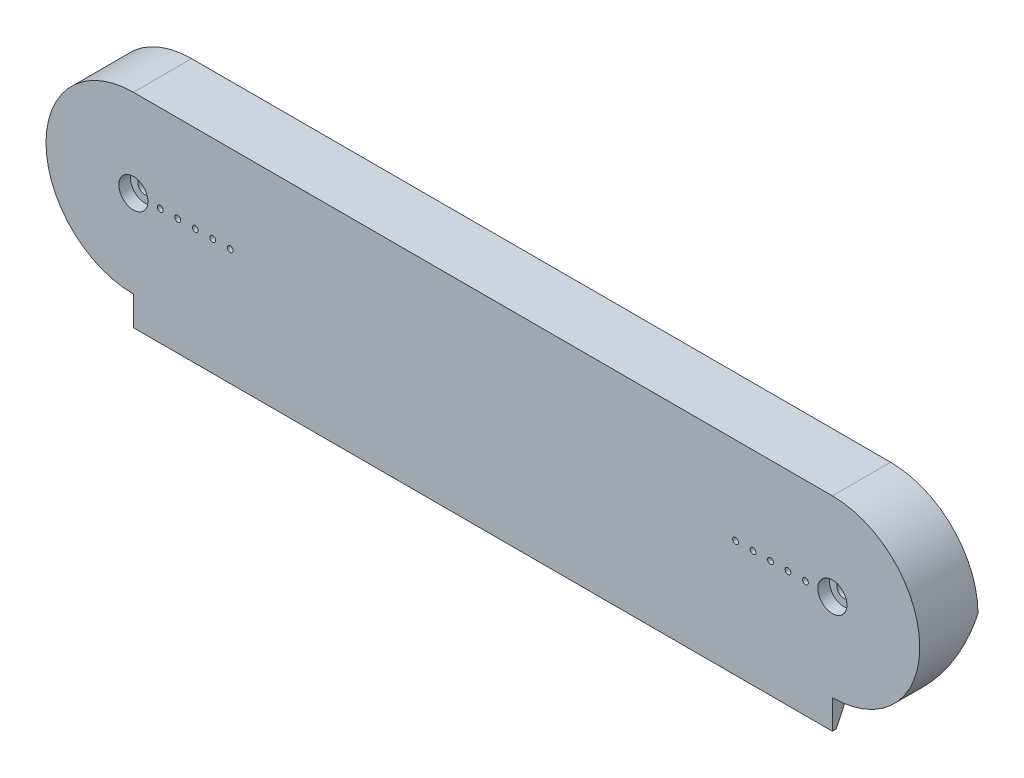
ISO-10303-21;
HEADER;
FILE_DESCRIPTION(('STEP AP214'),'2;1');
FILE_NAME('part.step','',(''),(''),'','','');
FILE_SCHEMA(('AUTOMOTIVE_DESIGN { 1 0 10303 214 1 1 1 1 }'));
ENDSEC;
DATA;
#1=APPLICATION_CONTEXT('core data for automotive mechanical design processes');
#2=APPLICATION_PROTOCOL_DEFINITION('international standard','automotive_design',2000,#1);
#3=PRODUCT_CONTEXT('',#1,'mechanical');
#4=PRODUCT('Part','Part','',(#3));
#5=PRODUCT_RELATED_PRODUCT_CATEGORY('part','',(#4));
#6=PRODUCT_DEFINITION_FORMATION('','',#4);
#7=PRODUCT_DEFINITION_CONTEXT('part definition',#1,'design');
#8=PRODUCT_DEFINITION('design','',#6,#7);
#9=PRODUCT_DEFINITION_SHAPE('','',#8);
#10=(LENGTH_UNIT() NAMED_UNIT(*) SI_UNIT(.MILLI.,.METRE.));
#11=(NAMED_UNIT(*) PLANE_ANGLE_UNIT() SI_UNIT($,.RADIAN.));
#12=(NAMED_UNIT(*) SI_UNIT($,.STERADIAN.) SOLID_ANGLE_UNIT());
#13=UNCERTAINTY_MEASURE_WITH_UNIT(LENGTH_MEASURE(1.E-05),#10,'distance_accuracy_value','');
#14=(GEOMETRIC_REPRESENTATION_CONTEXT(3) GLOBAL_UNCERTAINTY_ASSIGNED_CONTEXT((#13)) GLOBAL_UNIT_ASSIGNED_CONTEXT((#10,
#11,#12)) REPRESENTATION_CONTEXT('',''));
#15=CARTESIAN_POINT('',(0.,0.,0.));
#16=DIRECTION('',(0.,0.,1.));
#17=DIRECTION('',(1.,0.,0.));
#18=AXIS2_PLACEMENT_3D('',#15,#16,#17);
#19=CARTESIAN_POINT('',(0.,0.,13.5355339059327));
#20=DIRECTION('',(0.,0.,-1.));
#21=DIRECTION('',(-1.,0.,0.));
#22=AXIS2_PLACEMENT_3D('',#19,#20,#21);
#23=CYLINDRICAL_SURFACE('',#22,1.25);
#24=CARTESIAN_POINT('',(0.,0.,5.));
#25=DIRECTION('',(0.,0.,1.));
#26=DIRECTION('',(1.,0.,0.));
#27=AXIS2_PLACEMENT_3D('',#24,#25,#26);
#28=CIRCLE('',#27,1.25);
#29=CARTESIAN_POINT('',(1.25000000000001,0.,5.));
#30=VERTEX_POINT('',#29);
#31=EDGE_CURVE('E774',#30,#30,#28,.T.);
#32=ORIENTED_EDGE('',*,*,#31,.F.);
#33=EDGE_LOOP('',(#32));
#34=FACE_BOUND('',#33,.T.);
#35=CARTESIAN_POINT('',(0.,0.,8.));
#36=DIRECTION('',(0.,0.,1.));
#37=DIRECTION('',(1.,0.,0.));
#38=AXIS2_PLACEMENT_3D('',#35,#36,#37);
#39=CIRCLE('',#38,1.25);
#40=CARTESIAN_POINT('',(1.25000000000001,0.,8.));
#41=VERTEX_POINT('',#40);
#42=EDGE_CURVE('E365',#41,#41,#39,.T.);
#43=ORIENTED_EDGE('',*,*,#42,.T.);
#44=EDGE_LOOP('',(#43));
#45=FACE_BOUND('',#44,.T.);
#46=ADVANCED_FACE('F41',(#34,#45),#23,.F.);
#47=CARTESIAN_POINT('',(0.,0.,0.));
#48=DIRECTION('',(0.,0.,1.));
#49=DIRECTION('',(1.,0.,0.));
#50=AXIS2_PLACEMENT_3D('',#47,#48,#49);
#51=PLANE('',#50);
#52=CARTESIAN_POINT('',(120.,0.,0.));
#53=DIRECTION('',(0.,0.,1.));
#54=DIRECTION('',(1.,0.,0.));
#55=AXIS2_PLACEMENT_3D('',#52,#53,#54);
#56=CIRCLE('',#55,15.);
#57=CARTESIAN_POINT('',(135.,0.,0.));
#58=VERTEX_POINT('',#57);
#59=CARTESIAN_POINT('',(120.,15.,0.));
#60=VERTEX_POINT('',#59);
#61=EDGE_CURVE('E334',#58,#60,#56,.T.);
#62=ORIENTED_EDGE('',*,*,#61,.F.);
#63=DIRECTION('',(-1.,0.,0.));
#64=VECTOR('',#63,1.);
#65=CARTESIAN_POINT('',(0.,0.,0.));
#66=LINE('',#65,#64);
#67=CARTESIAN_POINT('',(123.875,0.,0.));
#68=VERTEX_POINT('',#67);
#69=EDGE_CURVE('E386',#58,#68,#66,.T.);
#70=ORIENTED_EDGE('',*,*,#69,.T.);
#71=CARTESIAN_POINT('',(120.,0.,0.));
#72=DIRECTION('',(0.,0.,-1.));
#73=DIRECTION('',(-1.,0.,0.));
#74=AXIS2_PLACEMENT_3D('',#71,#72,#73);
#75=CIRCLE('',#74,3.875);
#76=CARTESIAN_POINT('',(119.66437007874,3.8604374824565,0.));
#77=VERTEX_POINT('',#76);
#78=EDGE_CURVE('E268',#77,#68,#75,.T.);
#79=ORIENTED_EDGE('',*,*,#78,.F.);
#80=DIRECTION('',(0.996241930956517,0.0866141732283465,0.));
#81=VECTOR('',#80,1.);
#82=CARTESIAN_POINT('',(119.66437007874,3.8604374824565,0.));
#83=LINE('',#82,#81);
#84=CARTESIAN_POINT('',(103.908464566929,2.49060482739129,0.));
#85=VERTEX_POINT('',#84);
#86=EDGE_CURVE('E274',#85,#77,#83,.T.);
#87=ORIENTED_EDGE('',*,*,#86,.F.);
#88=CARTESIAN_POINT('',(104.125,0.,0.));
#89=DIRECTION('',(0.,0.,-1.));
#90=DIRECTION('',(-1.,0.,0.));
#91=AXIS2_PLACEMENT_3D('',#88,#89,#90);
#92=CIRCLE('',#91,2.5);
#93=CARTESIAN_POINT('',(101.625,0.,0.));
#94=VERTEX_POINT('',#93);
#95=EDGE_CURVE('E290',#94,#85,#92,.T.);
#96=ORIENTED_EDGE('',*,*,#95,.F.);
#97=DIRECTION('',(-1.,0.,0.));
#98=VECTOR('',#97,1.);
#99=CARTESIAN_POINT('',(0.,0.,0.));
#100=LINE('',#99,#98);
#101=CARTESIAN_POINT('',(18.375,0.,0.));
#102=VERTEX_POINT('',#101);
#103=EDGE_CURVE('E383',#94,#102,#100,.T.);
#104=ORIENTED_EDGE('',*,*,#103,.T.);
#105=CARTESIAN_POINT('',(15.875,0.,0.));
#106=DIRECTION('',(0.,0.,1.));
#107=DIRECTION('',(1.,0.,0.));
#108=AXIS2_PLACEMENT_3D('',#105,#106,#107);
#109=CIRCLE('',#108,2.5);
#110=CARTESIAN_POINT('',(16.0915354330709,2.49060482739129,0.));
#111=VERTEX_POINT('',#110);
#112=EDGE_CURVE('E190',#102,#111,#109,.T.);
#113=ORIENTED_EDGE('',*,*,#112,.T.);
#114=DIRECTION('',(-0.996241930956517,0.0866141732283465,0.));
#115=VECTOR('',#114,1.);
#116=CARTESIAN_POINT('',(0.33562992125985,3.8604374824565,0.));
#117=LINE('',#116,#115);
#118=CARTESIAN_POINT('',(0.33562992125985,3.8604374824565,0.));
#119=VERTEX_POINT('',#118);
#120=EDGE_CURVE('E193',#111,#119,#117,.T.);
#121=ORIENTED_EDGE('',*,*,#120,.T.);
#122=CARTESIAN_POINT('',(0.,0.,0.));
#123=DIRECTION('',(0.,0.,1.));
#124=DIRECTION('',(1.,0.,0.));
#125=AXIS2_PLACEMENT_3D('',#122,#123,#124);
#126=CIRCLE('',#125,3.875);
#127=CARTESIAN_POINT('',(-3.87499999999999,0.,0.));
#128=VERTEX_POINT('',#127);
#129=EDGE_CURVE('E184',#119,#128,#126,.T.);
#130=ORIENTED_EDGE('',*,*,#129,.T.);
#131=DIRECTION('',(-1.,0.,0.));
#132=VECTOR('',#131,1.);
#133=CARTESIAN_POINT('',(0.,0.,0.));
#134=LINE('',#133,#132);
#135=CARTESIAN_POINT('',(-15.,0.,0.));
#136=VERTEX_POINT('',#135);
#137=EDGE_CURVE('E380',#128,#136,#134,.T.);
#138=ORIENTED_EDGE('',*,*,#137,.T.);
#139=CARTESIAN_POINT('',(0.,0.,0.));
#140=DIRECTION('',(0.,0.,1.));
#141=DIRECTION('',(1.,0.,0.));
#142=AXIS2_PLACEMENT_3D('',#139,#140,#141);
#143=CIRCLE('',#142,15.);
#144=CARTESIAN_POINT('',(0.,15.,0.));
#145=VERTEX_POINT('',#144);
#146=EDGE_CURVE('E299',#145,#136,#143,.T.);
#147=ORIENTED_EDGE('',*,*,#146,.F.);
#148=DIRECTION('',(-1.,0.,0.));
#149=VECTOR('',#148,1.);
#150=CARTESIAN_POINT('',(0.,15.,0.));
#151=LINE('',#150,#149);
#152=EDGE_CURVE('E316',#60,#145,#151,.T.);
#153=ORIENTED_EDGE('',*,*,#152,.F.);
#154=EDGE_LOOP('',(#62,#70,#79,#87,#96,#104,#113,#121,#130,#138,#147,#153));
#155=FACE_BOUND('',#154,.T.);
#156=ADVANCED_FACE('F411',(#155),#51,.F.);
#157=CARTESIAN_POINT('',(120.,0.,13.5355339059327));
#158=DIRECTION('',(0.,0.,-1.));
#159=DIRECTION('',(-1.,0.,0.));
#160=AXIS2_PLACEMENT_3D('',#157,#158,#159);
#161=CYLINDRICAL_SURFACE('',#160,1.25);
#162=CARTESIAN_POINT('',(120.,0.,5.));
#163=DIRECTION('',(0.,0.,-1.));
#164=DIRECTION('',(-1.,0.,0.));
#165=AXIS2_PLACEMENT_3D('',#162,#163,#164);
#166=CIRCLE('',#165,1.25);
#167=CARTESIAN_POINT('',(118.75,0.,5.));
#168=VERTEX_POINT('',#167);
#169=EDGE_CURVE('E224',#168,#168,#166,.T.);
#170=ORIENTED_EDGE('',*,*,#169,.T.);
#171=EDGE_LOOP('',(#170));
#172=FACE_BOUND('',#171,.T.);
#173=CARTESIAN_POINT('',(120.,0.,8.));
#174=DIRECTION('',(0.,0.,1.));
#175=DIRECTION('',(1.,0.,0.));
#176=AXIS2_PLACEMENT_3D('',#173,#174,#175);
#177=CIRCLE('',#176,1.25);
#178=CARTESIAN_POINT('',(121.25,0.,8.));
#179=VERTEX_POINT('',#178);
#180=EDGE_CURVE('E220',#179,#179,#177,.F.);
#181=ORIENTED_EDGE('',*,*,#180,.F.);
#182=EDGE_LOOP('',(#181));
#183=FACE_BOUND('',#182,.T.);
#184=ADVANCED_FACE('F432',(#172,#183),#161,.F.);
#185=CARTESIAN_POINT('',(0.,0.,10.));
#186=DIRECTION('',(0.,0.,-1.));
#187=DIRECTION('',(-1.,0.,0.));
#188=AXIS2_PLACEMENT_3D('',#185,#186,#187);
#189=CYLINDRICAL_SURFACE('',#188,15.);
#190=ORIENTED_EDGE('',*,*,#146,.T.);
#191=CARTESIAN_POINT('',(0.,0.,0.));
#192=DIRECTION('',(0.,0.4226182617407,0.90630778703665));
#193=DIRECTION('',(0.,0.90630778703665,-0.4226182617407));
#194=AXIS2_PLACEMENT_3D('',#191,#192,#193);
#195=ELLIPSE('',#194,16.5506687844374,15.);
#196=CARTESIAN_POINT('',(0.,-15.,6.99461487232499));
#197=VERTEX_POINT('',#196);
#198=EDGE_CURVE('E51',#136,#197,#195,.T.);
#199=ORIENTED_EDGE('',*,*,#198,.T.);
#200=DIRECTION('',(0.,0.,-1.));
#201=VECTOR('',#200,1.);
#202=CARTESIAN_POINT('',(0.,-15.,10.));
#203=LINE('',#202,#201);
#204=CARTESIAN_POINT('',(0.,-15.,10.));
#205=VERTEX_POINT('',#204);
#206=EDGE_CURVE('E358',#205,#197,#203,.T.);
#207=ORIENTED_EDGE('',*,*,#206,.F.);
#208=CARTESIAN_POINT('',(0.,0.,10.));
#209=DIRECTION('',(0.,0.,1.));
#210=DIRECTION('',(1.,0.,0.));
#211=AXIS2_PLACEMENT_3D('',#208,#209,#210);
#212=CIRCLE('',#211,15.);
#213=CARTESIAN_POINT('',(0.,15.,10.));
#214=VERTEX_POINT('',#213);
#215=EDGE_CURVE('E311',#214,#205,#212,.T.);
#216=ORIENTED_EDGE('',*,*,#215,.F.);
#217=DIRECTION('',(0.,0.,-1.));
#218=VECTOR('',#217,1.);
#219=CARTESIAN_POINT('',(0.,15.,10.));
#220=LINE('',#219,#218);
#221=EDGE_CURVE('E331',#214,#145,#220,.T.);
#222=ORIENTED_EDGE('',*,*,#221,.T.);
#223=EDGE_LOOP('',(#190,#199,#207,#216,#222));
#224=FACE_BOUND('',#223,.T.);
#225=ADVANCED_FACE('F430',(#224),#189,.T.);
#226=CARTESIAN_POINT('',(0.,-15.,10.));
#227=DIRECTION('',(1.,0.,0.));
#228=DIRECTION('',(0.,1.,0.));
#229=AXIS2_PLACEMENT_3D('',#226,#227,#228);
#230=PLANE('',#229);
#231=ORIENTED_EDGE('',*,*,#206,.T.);
#232=DIRECTION('',(0.,0.90630778703665,-0.4226182617407));
#233=VECTOR('',#232,1.);
#234=CARTESIAN_POINT('',(0.,-20.,9.32615316309998));
#235=LINE('',#234,#233);
#236=CARTESIAN_POINT('',(0.,-20.,9.32615316309998));
#237=VERTEX_POINT('',#236);
#238=EDGE_CURVE('E11',#197,#237,#235,.F.);
#239=ORIENTED_EDGE('',*,*,#238,.T.);
#240=DIRECTION('',(0.,0.,-1.));
#241=VECTOR('',#240,1.);
#242=CARTESIAN_POINT('',(0.,-20.,10.));
#243=LINE('',#242,#241);
#244=CARTESIAN_POINT('',(0.,-20.,10.));
#245=VERTEX_POINT('',#244);
#246=EDGE_CURVE('E354',#245,#237,#243,.T.);
#247=ORIENTED_EDGE('',*,*,#246,.F.);
#248=DIRECTION('',(0.,-1.,0.));
#249=VECTOR('',#248,1.);
#250=CARTESIAN_POINT('',(0.,-15.,10.));
#251=LINE('',#250,#249);
#252=EDGE_CURVE('E315',#205,#245,#251,.T.);
#253=ORIENTED_EDGE('',*,*,#252,.F.);
#254=EDGE_LOOP('',(#231,#239,#247,#253));
#255=FACE_BOUND('',#254,.T.);
#256=ADVANCED_FACE('F418',(#255),#230,.F.);
#257=CARTESIAN_POINT('',(0.,-20.,10.));
#258=DIRECTION('',(0.,1.,0.));
#259=DIRECTION('',(0.,0.,1.));
#260=AXIS2_PLACEMENT_3D('',#257,#258,#259);
#261=PLANE('',#260);
#262=ORIENTED_EDGE('',*,*,#246,.T.);
#263=DIRECTION('',(1.,0.,0.));
#264=VECTOR('',#263,1.);
#265=CARTESIAN_POINT('',(0.,-20.,9.32615316309998));
#266=LINE('',#265,#264);
#267=CARTESIAN_POINT('',(120.,-20.,9.32615316309998));
#268=VERTEX_POINT('',#267);
#269=EDGE_CURVE('E361',#237,#268,#266,.T.);
#270=ORIENTED_EDGE('',*,*,#269,.T.);
#271=DIRECTION('',(0.,0.,-1.));
#272=VECTOR('',#271,1.);
#273=CARTESIAN_POINT('',(120.,-20.,10.));
#274=LINE('',#273,#272);
#275=CARTESIAN_POINT('',(120.,-20.,10.));
#276=VERTEX_POINT('',#275);
#277=EDGE_CURVE('E350',#276,#268,#274,.T.);
#278=ORIENTED_EDGE('',*,*,#277,.F.);
#279=DIRECTION('',(1.,0.,0.));
#280=VECTOR('',#279,1.);
#281=CARTESIAN_POINT('',(0.,-20.,10.));
#282=LINE('',#281,#280);
#283=EDGE_CURVE('E319',#245,#276,#282,.T.);
#284=ORIENTED_EDGE('',*,*,#283,.F.);
#285=EDGE_LOOP('',(#262,#270,#278,#284));
#286=FACE_BOUND('',#285,.T.);
#287=ADVANCED_FACE('F421',(#286),#261,.F.);
#288=CARTESIAN_POINT('',(120.,-15.,10.));
#289=DIRECTION('',(-1.,0.,0.));
#290=DIRECTION('',(0.,-1.,0.));
#291=AXIS2_PLACEMENT_3D('',#288,#289,#290);
#292=PLANE('',#291);
#293=ORIENTED_EDGE('',*,*,#277,.T.);
#294=DIRECTION('',(0.,-0.90630778703665,0.4226182617407));
#295=VECTOR('',#294,1.);
#296=CARTESIAN_POINT('',(120.,-20.000000000006,9.32615316310279));
#297=LINE('',#296,#295);
#298=CARTESIAN_POINT('',(120.,-15.,6.99461487232499));
#299=VERTEX_POINT('',#298);
#300=EDGE_CURVE('E374',#268,#299,#297,.F.);
#301=ORIENTED_EDGE('',*,*,#300,.T.);
#302=DIRECTION('',(0.,0.,-1.));
#303=VECTOR('',#302,1.);
#304=CARTESIAN_POINT('',(120.,-15.,10.));
#305=LINE('',#304,#303);
#306=CARTESIAN_POINT('',(120.,-15.,10.));
#307=VERTEX_POINT('',#306);
#308=EDGE_CURVE('E346',#307,#299,#305,.T.);
#309=ORIENTED_EDGE('',*,*,#308,.F.);
#310=DIRECTION('',(0.,1.,0.));
#311=VECTOR('',#310,1.);
#312=CARTESIAN_POINT('',(120.,-15.,10.));
#313=LINE('',#312,#311);
#314=EDGE_CURVE('E322',#276,#307,#313,.T.);
#315=ORIENTED_EDGE('',*,*,#314,.F.);
#316=EDGE_LOOP('',(#293,#301,#309,#315));
#317=FACE_BOUND('',#316,.T.);
#318=ADVANCED_FACE('F545',(#317),#292,.F.);
#319=CARTESIAN_POINT('',(120.,0.,10.));
#320=DIRECTION('',(0.,0.,-1.));
#321=DIRECTION('',(-1.,0.,0.));
#322=AXIS2_PLACEMENT_3D('',#319,#320,#321);
#323=CYLINDRICAL_SURFACE('',#322,15.);
#324=ORIENTED_EDGE('',*,*,#308,.T.);
#325=CARTESIAN_POINT('',(120.,0.,0.));
#326=DIRECTION('',(0.,0.4226182617407,0.90630778703665));
#327=DIRECTION('',(0.,0.90630778703665,-0.4226182617407));
#328=AXIS2_PLACEMENT_3D('',#325,#326,#327);
#329=ELLIPSE('',#328,16.5506687844374,15.);
#330=EDGE_CURVE('E377',#299,#58,#329,.T.);
#331=ORIENTED_EDGE('',*,*,#330,.T.);
#332=ORIENTED_EDGE('',*,*,#61,.T.);
#333=DIRECTION('',(0.,0.,-1.));
#334=VECTOR('',#333,1.);
#335=CARTESIAN_POINT('',(120.,15.,10.));
#336=LINE('',#335,#334);
#337=CARTESIAN_POINT('',(120.,15.,10.));
#338=VERTEX_POINT('',#337);
#339=EDGE_CURVE('E342',#338,#60,#336,.T.);
#340=ORIENTED_EDGE('',*,*,#339,.F.);
#341=CARTESIAN_POINT('',(120.,0.,10.));
#342=DIRECTION('',(0.,0.,1.));
#343=DIRECTION('',(1.,0.,0.));
#344=AXIS2_PLACEMENT_3D('',#341,#342,#343);
#345=CIRCLE('',#344,15.);
#346=EDGE_CURVE('E325',#307,#338,#345,.T.);
#347=ORIENTED_EDGE('',*,*,#346,.F.);
#348=EDGE_LOOP('',(#324,#331,#332,#340,#347));
#349=FACE_BOUND('',#348,.T.);
#350=ADVANCED_FACE('F541',(#349),#323,.T.);
#351=CARTESIAN_POINT('',(0.,15.,10.));
#352=DIRECTION('',(0.,-1.,0.));
#353=DIRECTION('',(0.,0.,-1.));
#354=AXIS2_PLACEMENT_3D('',#351,#352,#353);
#355=PLANE('',#354);
#356=ORIENTED_EDGE('',*,*,#152,.T.);
#357=ORIENTED_EDGE('',*,*,#221,.F.);
#358=DIRECTION('',(-1.,0.,0.));
#359=VECTOR('',#358,1.);
#360=CARTESIAN_POINT('',(0.,15.,10.));
#361=LINE('',#360,#359);
#362=EDGE_CURVE('E328',#338,#214,#361,.T.);
#363=ORIENTED_EDGE('',*,*,#362,.F.);
#364=ORIENTED_EDGE('',*,*,#339,.T.);
#365=EDGE_LOOP('',(#356,#357,#363,#364));
#366=FACE_BOUND('',#365,.T.);
#367=ADVANCED_FACE('F536',(#366),#355,.F.);
#368=CARTESIAN_POINT('',(0.,0.,10.));
#369=DIRECTION('',(0.,0.,1.));
#370=DIRECTION('',(1.,0.,0.));
#371=AXIS2_PLACEMENT_3D('',#368,#369,#370);
#372=PLANE('',#371);
#373=CARTESIAN_POINT('',(0.,0.,10.));
#374=DIRECTION('',(0.,0.,-1.));
#375=DIRECTION('',(-1.,0.,0.));
#376=AXIS2_PLACEMENT_3D('',#373,#374,#375);
#377=CIRCLE('',#376,2.50000000000001);
#378=CARTESIAN_POINT('',(-2.49999999999999,0.,10.));
#379=VERTEX_POINT('',#378);
#380=EDGE_CURVE('E768',#379,#379,#377,.T.);
#381=ORIENTED_EDGE('',*,*,#380,.T.);
#382=EDGE_LOOP('',(#381));
#383=FACE_BOUND('',#382,.T.);
#384=CARTESIAN_POINT('',(16.625,0.,10.));
#385=DIRECTION('',(0.,0.,1.));
#386=DIRECTION('',(1.,0.,0.));
#387=AXIS2_PLACEMENT_3D('',#384,#385,#386);
#388=CIRCLE('',#387,0.499999999999999);
#389=CARTESIAN_POINT('',(17.125,0.,10.));
#390=VERTEX_POINT('',#389);
#391=EDGE_CURVE('E800',#390,#390,#388,.T.);
#392=ORIENTED_EDGE('',*,*,#391,.F.);
#393=EDGE_LOOP('',(#392));
#394=FACE_BOUND('',#393,.T.);
#395=CARTESIAN_POINT('',(13.625,0.,10.));
#396=DIRECTION('',(0.,0.,1.));
#397=DIRECTION('',(1.,0.,0.));
#398=AXIS2_PLACEMENT_3D('',#395,#396,#397);
#399=CIRCLE('',#398,0.499999999999999);
#400=CARTESIAN_POINT('',(14.125,0.,10.));
#401=VERTEX_POINT('',#400);
#402=EDGE_CURVE('E792',#401,#401,#399,.T.);
#403=ORIENTED_EDGE('',*,*,#402,.F.);
#404=EDGE_LOOP('',(#403));
#405=FACE_BOUND('',#404,.T.);
#406=CARTESIAN_POINT('',(10.625,0.,10.));
#407=DIRECTION('',(0.,0.,1.));
#408=DIRECTION('',(1.,0.,0.));
#409=AXIS2_PLACEMENT_3D('',#406,#407,#408);
#410=CIRCLE('',#409,0.499999999999999);
#411=CARTESIAN_POINT('',(11.125,0.,10.));
#412=VERTEX_POINT('',#411);
#413=EDGE_CURVE('E784',#412,#412,#410,.T.);
#414=ORIENTED_EDGE('',*,*,#413,.F.);
#415=EDGE_LOOP('',(#414));
#416=FACE_BOUND('',#415,.T.);
#417=CARTESIAN_POINT('',(7.62500000000002,0.,10.));
#418=DIRECTION('',(0.,0.,1.));
#419=DIRECTION('',(1.,0.,0.));
#420=AXIS2_PLACEMENT_3D('',#417,#418,#419);
#421=CIRCLE('',#420,0.499999999999999);
#422=CARTESIAN_POINT('',(8.12500000000002,0.,10.));
#423=VERTEX_POINT('',#422);
#424=EDGE_CURVE('E779',#423,#423,#421,.T.);
#425=ORIENTED_EDGE('',*,*,#424,.F.);
#426=EDGE_LOOP('',(#425));
#427=FACE_BOUND('',#426,.T.);
#428=CARTESIAN_POINT('',(4.62500000000002,0.,10.));
#429=DIRECTION('',(0.,0.,1.));
#430=DIRECTION('',(1.,0.,0.));
#431=AXIS2_PLACEMENT_3D('',#428,#429,#430);
#432=CIRCLE('',#431,0.499999999999999);
#433=CARTESIAN_POINT('',(5.12500000000002,0.,10.));
#434=VERTEX_POINT('',#433);
#435=EDGE_CURVE('E196',#434,#434,#432,.T.);
#436=ORIENTED_EDGE('',*,*,#435,.F.);
#437=EDGE_LOOP('',(#436));
#438=FACE_BOUND('',#437,.T.);
#439=CARTESIAN_POINT('',(120.,0.,10.));
#440=DIRECTION('',(0.,0.,1.));
#441=DIRECTION('',(1.,0.,0.));
#442=AXIS2_PLACEMENT_3D('',#439,#440,#441);
#443=CIRCLE('',#442,2.50000000000001);
#444=CARTESIAN_POINT('',(122.5,0.,10.));
#445=VERTEX_POINT('',#444);
#446=EDGE_CURVE('E210',#445,#445,#443,.T.);
#447=ORIENTED_EDGE('',*,*,#446,.F.);
#448=EDGE_LOOP('',(#447));
#449=FACE_BOUND('',#448,.T.);
#450=CARTESIAN_POINT('',(103.375,0.,10.));
#451=DIRECTION('',(0.,0.,1.));
#452=DIRECTION('',(1.,0.,0.));
#453=AXIS2_PLACEMENT_3D('',#450,#451,#452);
#454=CIRCLE('',#453,0.499999999999999);
#455=CARTESIAN_POINT('',(103.875,0.,10.));
#456=VERTEX_POINT('',#455);
#457=EDGE_CURVE('E250',#456,#456,#454,.F.);
#458=ORIENTED_EDGE('',*,*,#457,.T.);
#459=EDGE_LOOP('',(#458));
#460=FACE_BOUND('',#459,.T.);
#461=CARTESIAN_POINT('',(106.375,0.,10.));
#462=DIRECTION('',(0.,0.,1.));
#463=DIRECTION('',(1.,0.,0.));
#464=AXIS2_PLACEMENT_3D('',#461,#462,#463);
#465=CIRCLE('',#464,0.499999999999999);
#466=CARTESIAN_POINT('',(106.875,0.,10.));
#467=VERTEX_POINT('',#466);
#468=EDGE_CURVE('E242',#467,#467,#465,.F.);
#469=ORIENTED_EDGE('',*,*,#468,.T.);
#470=EDGE_LOOP('',(#469));
#471=FACE_BOUND('',#470,.T.);
#472=CARTESIAN_POINT('',(109.375,0.,10.));
#473=DIRECTION('',(0.,0.,1.));
#474=DIRECTION('',(1.,0.,0.));
#475=AXIS2_PLACEMENT_3D('',#472,#473,#474);
#476=CIRCLE('',#475,0.499999999999999);
#477=CARTESIAN_POINT('',(109.875,0.,10.));
#478=VERTEX_POINT('',#477);
#479=EDGE_CURVE('E234',#478,#478,#476,.F.);
#480=ORIENTED_EDGE('',*,*,#479,.T.);
#481=EDGE_LOOP('',(#480));
#482=FACE_BOUND('',#481,.T.);
#483=CARTESIAN_POINT('',(112.375,0.,10.));
#484=DIRECTION('',(0.,0.,1.));
#485=DIRECTION('',(1.,0.,0.));
#486=AXIS2_PLACEMENT_3D('',#483,#484,#485);
#487=CIRCLE('',#486,0.499999999999999);
#488=CARTESIAN_POINT('',(112.875,0.,10.));
#489=VERTEX_POINT('',#488);
#490=EDGE_CURVE('E229',#489,#489,#487,.F.);
#491=ORIENTED_EDGE('',*,*,#490,.T.);
#492=EDGE_LOOP('',(#491));
#493=FACE_BOUND('',#492,.T.);
#494=CARTESIAN_POINT('',(115.375,0.,10.));
#495=DIRECTION('',(0.,0.,1.));
#496=DIRECTION('',(1.,0.,0.));
#497=AXIS2_PLACEMENT_3D('',#494,#495,#496);
#498=CIRCLE('',#497,0.499999999999999);
#499=CARTESIAN_POINT('',(115.875,0.,10.));
#500=VERTEX_POINT('',#499);
#501=EDGE_CURVE('E264',#500,#500,#498,.F.);
#502=ORIENTED_EDGE('',*,*,#501,.T.);
#503=EDGE_LOOP('',(#502));
#504=FACE_BOUND('',#503,.T.);
#505=ORIENTED_EDGE('',*,*,#215,.T.);
#506=ORIENTED_EDGE('',*,*,#252,.T.);
#507=ORIENTED_EDGE('',*,*,#283,.T.);
#508=ORIENTED_EDGE('',*,*,#314,.T.);
#509=ORIENTED_EDGE('',*,*,#346,.T.);
#510=ORIENTED_EDGE('',*,*,#362,.T.);
#511=EDGE_LOOP('',(#505,#506,#507,#508,#509,#510));
#512=FACE_BOUND('',#511,.T.);
#513=ADVANCED_FACE('F425',(#383,#394,#405,#416,#427,#438,#449,#460,#471,#482,#493,#504,#512),
#372,.T.);
#514=CARTESIAN_POINT('',(120.,0.,5.));
#515=DIRECTION('',(0.,0.,-1.));
#516=DIRECTION('',(-1.,0.,0.));
#517=AXIS2_PLACEMENT_3D('',#514,#515,#516);
#518=CYLINDRICAL_SURFACE('',#517,3.875);
#519=ORIENTED_EDGE('',*,*,#78,.T.);
#520=CARTESIAN_POINT('',(120.,0.,0.));
#521=DIRECTION('',(0.,0.4226182617407,0.90630778703665));
#522=DIRECTION('',(0.,0.90630778703665,-0.4226182617407));
#523=AXIS2_PLACEMENT_3D('',#520,#521,#522);
#524=ELLIPSE('',#523,4.27558943597966,3.875);
#525=CARTESIAN_POINT('',(119.66437007874,-3.8604374824565,1.80015156189807));
#526=VERTEX_POINT('',#525);
#527=EDGE_CURVE('E389',#68,#526,#524,.F.);
#528=ORIENTED_EDGE('',*,*,#527,.T.);
#529=DIRECTION('',(0.,0.,-1.));
#530=VECTOR('',#529,1.);
#531=CARTESIAN_POINT('',(119.66437007874,-3.8604374824565,5.));
#532=LINE('',#531,#530);
#533=CARTESIAN_POINT('',(119.66437007874,-3.8604374824565,5.));
#534=VERTEX_POINT('',#533);
#535=EDGE_CURVE('E286',#534,#526,#532,.T.);
#536=ORIENTED_EDGE('',*,*,#535,.F.);
#537=CARTESIAN_POINT('',(120.,0.,5.));
#538=DIRECTION('',(0.,0.,-1.));
#539=DIRECTION('',(-1.,0.,0.));
#540=AXIS2_PLACEMENT_3D('',#537,#538,#539);
#541=CIRCLE('',#540,3.875);
#542=CARTESIAN_POINT('',(119.66437007874,3.8604374824565,5.));
#543=VERTEX_POINT('',#542);
#544=EDGE_CURVE('E269',#543,#534,#541,.T.);
#545=ORIENTED_EDGE('',*,*,#544,.F.);
#546=DIRECTION('',(0.,0.,-1.));
#547=VECTOR('',#546,1.);
#548=CARTESIAN_POINT('',(119.66437007874,3.8604374824565,5.));
#549=LINE('',#548,#547);
#550=EDGE_CURVE('E296',#543,#77,#549,.T.);
#551=ORIENTED_EDGE('',*,*,#550,.T.);
#552=EDGE_LOOP('',(#519,#528,#536,#545,#551));
#553=FACE_BOUND('',#552,.T.);
#554=ADVANCED_FACE('F524',(#553),#518,.F.);
#555=CARTESIAN_POINT('',(119.66437007874,3.8604374824565,5.));
#556=DIRECTION('',(-0.0866141732283465,0.996241930956517,0.));
#557=DIRECTION('',(-0.996241930956517,-0.0866141732283465,0.));
#558=AXIS2_PLACEMENT_3D('',#555,#556,#557);
#559=PLANE('',#558);
#560=ORIENTED_EDGE('',*,*,#86,.T.);
#561=ORIENTED_EDGE('',*,*,#550,.F.);
#562=DIRECTION('',(0.996241930956517,0.0866141732283465,0.));
#563=VECTOR('',#562,1.);
#564=CARTESIAN_POINT('',(119.66437007874,3.8604374824565,5.));
#565=LINE('',#564,#563);
#566=CARTESIAN_POINT('',(103.908464566929,2.49060482739129,5.));
#567=VERTEX_POINT('',#566);
#568=EDGE_CURVE('E282',#567,#543,#565,.T.);
#569=ORIENTED_EDGE('',*,*,#568,.F.);
#570=DIRECTION('',(0.,0.,-1.));
#571=VECTOR('',#570,1.);
#572=CARTESIAN_POINT('',(103.908464566929,2.49060482739129,5.));
#573=LINE('',#572,#571);
#574=EDGE_CURVE('E300',#567,#85,#573,.T.);
#575=ORIENTED_EDGE('',*,*,#574,.T.);
#576=EDGE_LOOP('',(#560,#561,#569,#575));
#577=FACE_BOUND('',#576,.T.);
#578=ADVANCED_FACE('F520',(#577),#559,.F.);
#579=CARTESIAN_POINT('',(104.125,0.,5.));
#580=DIRECTION('',(0.,0.,-1.));
#581=DIRECTION('',(-1.,0.,0.));
#582=AXIS2_PLACEMENT_3D('',#579,#580,#581);
#583=CYLINDRICAL_SURFACE('',#582,2.5);
#584=DIRECTION('',(0.,0.,-1.));
#585=VECTOR('',#584,1.);
#586=CARTESIAN_POINT('',(103.908464566929,-2.49060482739129,5.));
#587=LINE('',#586,#585);
#588=CARTESIAN_POINT('',(103.908464566929,-2.49060482739129,5.));
#589=VERTEX_POINT('',#588);
#590=CARTESIAN_POINT('',(103.908464566929,-2.49060482739129,1.16138810445037));
#591=VERTEX_POINT('',#590);
#592=EDGE_CURVE('E304',#589,#591,#587,.T.);
#593=ORIENTED_EDGE('',*,*,#592,.T.);
#594=CARTESIAN_POINT('',(104.125,0.,0.));
#595=DIRECTION('',(0.,0.4226182617407,0.90630778703665));
#596=DIRECTION('',(0.,0.90630778703665,-0.4226182617407));
#597=AXIS2_PLACEMENT_3D('',#594,#595,#596);
#598=ELLIPSE('',#597,2.75844479740623,2.5);
#599=EDGE_CURVE('E395',#591,#94,#598,.F.);
#600=ORIENTED_EDGE('',*,*,#599,.T.);
#601=ORIENTED_EDGE('',*,*,#95,.T.);
#602=ORIENTED_EDGE('',*,*,#574,.F.);
#603=CARTESIAN_POINT('',(104.125,0.,5.));
#604=DIRECTION('',(0.,0.,-1.));
#605=DIRECTION('',(-1.,0.,0.));
#606=AXIS2_PLACEMENT_3D('',#603,#604,#605);
#607=CIRCLE('',#606,2.5);
#608=EDGE_CURVE('E278',#589,#567,#607,.T.);
#609=ORIENTED_EDGE('',*,*,#608,.F.);
#610=EDGE_LOOP('',(#593,#600,#601,#602,#609));
#611=FACE_BOUND('',#610,.T.);
#612=ADVANCED_FACE('F523',(#611),#583,.F.);
#613=CARTESIAN_POINT('',(119.66437007874,-3.8604374824565,5.));
#614=DIRECTION('',(-0.0866141732283466,-0.996241930956517,0.));
#615=DIRECTION('',(0.996241930956517,-0.0866141732283466,0.));
#616=AXIS2_PLACEMENT_3D('',#613,#614,#615);
#617=PLANE('',#616);
#618=ORIENTED_EDGE('',*,*,#535,.T.);
#619=DIRECTION('',(0.995430359233058,-0.086543614449742,0.0403559501823283));
#620=VECTOR('',#619,1.);
#621=CARTESIAN_POINT('',(2.78387195243245,6.30125858469018,-2.93832513405596));
#622=LINE('',#621,#620);
#623=EDGE_CURVE('E392',#526,#591,#622,.F.);
#624=ORIENTED_EDGE('',*,*,#623,.T.);
#625=ORIENTED_EDGE('',*,*,#592,.F.);
#626=DIRECTION('',(-0.996241930956517,0.0866141732283466,0.));
#627=VECTOR('',#626,1.);
#628=CARTESIAN_POINT('',(119.66437007874,-3.8604374824565,5.));
#629=LINE('',#628,#627);
#630=EDGE_CURVE('E273',#534,#589,#629,.T.);
#631=ORIENTED_EDGE('',*,*,#630,.F.);
#632=EDGE_LOOP('',(#618,#624,#625,#631));
#633=FACE_BOUND('',#632,.T.);
#634=ADVANCED_FACE('F518',(#633),#617,.F.);
#635=CARTESIAN_POINT('',(120.,0.,5.));
#636=DIRECTION('',(0.,0.,-1.));
#637=DIRECTION('',(-1.,0.,0.));
#638=AXIS2_PLACEMENT_3D('',#635,#636,#637);
#639=PLANE('',#638);
#640=CARTESIAN_POINT('',(103.375,0.,5.));
#641=DIRECTION('',(0.,0.,-1.));
#642=DIRECTION('',(-1.,0.,0.));
#643=AXIS2_PLACEMENT_3D('',#640,#641,#642);
#644=CIRCLE('',#643,0.499999999999999);
#645=CARTESIAN_POINT('',(102.875,0.,5.));
#646=VERTEX_POINT('',#645);
#647=EDGE_CURVE('E254',#646,#646,#644,.T.);
#648=ORIENTED_EDGE('',*,*,#647,.F.);
#649=EDGE_LOOP('',(#648));
#650=FACE_BOUND('',#649,.T.);
#651=CARTESIAN_POINT('',(106.375,0.,5.));
#652=DIRECTION('',(0.,0.,-1.));
#653=DIRECTION('',(-1.,0.,0.));
#654=AXIS2_PLACEMENT_3D('',#651,#652,#653);
#655=CIRCLE('',#654,0.499999999999999);
#656=CARTESIAN_POINT('',(105.875,0.,5.));
#657=VERTEX_POINT('',#656);
#658=EDGE_CURVE('E246',#657,#657,#655,.T.);
#659=ORIENTED_EDGE('',*,*,#658,.F.);
#660=EDGE_LOOP('',(#659));
#661=FACE_BOUND('',#660,.T.);
#662=CARTESIAN_POINT('',(109.375,0.,5.));
#663=DIRECTION('',(0.,0.,-1.));
#664=DIRECTION('',(-1.,0.,0.));
#665=AXIS2_PLACEMENT_3D('',#662,#663,#664);
#666=CIRCLE('',#665,0.499999999999999);
#667=CARTESIAN_POINT('',(108.875,0.,5.));
#668=VERTEX_POINT('',#667);
#669=EDGE_CURVE('E238',#668,#668,#666,.T.);
#670=ORIENTED_EDGE('',*,*,#669,.F.);
#671=EDGE_LOOP('',(#670));
#672=FACE_BOUND('',#671,.T.);
#673=CARTESIAN_POINT('',(112.375,0.,5.));
#674=DIRECTION('',(0.,0.,-1.));
#675=DIRECTION('',(-1.,0.,0.));
#676=AXIS2_PLACEMENT_3D('',#673,#674,#675);
#677=CIRCLE('',#676,0.499999999999999);
#678=CARTESIAN_POINT('',(111.875,0.,5.));
#679=VERTEX_POINT('',#678);
#680=EDGE_CURVE('E230',#679,#679,#677,.T.);
#681=ORIENTED_EDGE('',*,*,#680,.F.);
#682=EDGE_LOOP('',(#681));
#683=FACE_BOUND('',#682,.T.);
#684=ORIENTED_EDGE('',*,*,#169,.F.);
#685=EDGE_LOOP('',(#684));
#686=FACE_BOUND('',#685,.T.);
#687=CARTESIAN_POINT('',(115.375,0.,5.));
#688=DIRECTION('',(0.,0.,-1.));
#689=DIRECTION('',(-1.,0.,0.));
#690=AXIS2_PLACEMENT_3D('',#687,#688,#689);
#691=CIRCLE('',#690,0.499999999999999);
#692=CARTESIAN_POINT('',(114.875,0.,5.));
#693=VERTEX_POINT('',#692);
#694=EDGE_CURVE('E228',#693,#693,#691,.T.);
#695=ORIENTED_EDGE('',*,*,#694,.F.);
#696=EDGE_LOOP('',(#695));
#697=FACE_BOUND('',#696,.T.);
#698=ORIENTED_EDGE('',*,*,#544,.T.);
#699=ORIENTED_EDGE('',*,*,#630,.T.);
#700=ORIENTED_EDGE('',*,*,#608,.T.);
#701=ORIENTED_EDGE('',*,*,#568,.T.);
#702=EDGE_LOOP('',(#698,#699,#700,#701));
#703=FACE_BOUND('',#702,.T.);
#704=ADVANCED_FACE('F514',(#650,#661,#672,#683,#686,#697,#703),#639,.T.);
#705=CARTESIAN_POINT('',(115.375,0.,13.5355339059327));
#706=DIRECTION('',(0.,0.,-1.));
#707=DIRECTION('',(-1.,0.,0.));
#708=AXIS2_PLACEMENT_3D('',#705,#706,#707);
#709=CYLINDRICAL_SURFACE('',#708,0.499999999999999);
#710=ORIENTED_EDGE('',*,*,#694,.T.);
#711=EDGE_LOOP('',(#710));
#712=FACE_BOUND('',#711,.T.);
#713=ORIENTED_EDGE('',*,*,#501,.F.);
#714=EDGE_LOOP('',(#713));
#715=FACE_BOUND('',#714,.T.);
#716=ADVANCED_FACE('F500',(#712,#715),#709,.F.);
#717=CARTESIAN_POINT('',(112.375,0.,13.5355339059327));
#718=DIRECTION('',(0.,0.,-1.));
#719=DIRECTION('',(-1.,0.,0.));
#720=AXIS2_PLACEMENT_3D('',#717,#718,#719);
#721=CYLINDRICAL_SURFACE('',#720,0.499999999999999);
#722=ORIENTED_EDGE('',*,*,#680,.T.);
#723=EDGE_LOOP('',(#722));
#724=FACE_BOUND('',#723,.T.);
#725=ORIENTED_EDGE('',*,*,#490,.F.);
#726=EDGE_LOOP('',(#725));
#727=FACE_BOUND('',#726,.T.);
#728=ADVANCED_FACE('F496',(#724,#727),#721,.F.);
#729=CARTESIAN_POINT('',(109.375,0.,13.5355339059327));
#730=DIRECTION('',(0.,0.,-1.));
#731=DIRECTION('',(-1.,0.,0.));
#732=AXIS2_PLACEMENT_3D('',#729,#730,#731);
#733=CYLINDRICAL_SURFACE('',#732,0.499999999999999);
#734=ORIENTED_EDGE('',*,*,#669,.T.);
#735=EDGE_LOOP('',(#734));
#736=FACE_BOUND('',#735,.T.);
#737=ORIENTED_EDGE('',*,*,#479,.F.);
#738=EDGE_LOOP('',(#737));
#739=FACE_BOUND('',#738,.T.);
#740=ADVANCED_FACE('F499',(#736,#739),#733,.F.);
#741=CARTESIAN_POINT('',(106.375,0.,13.5355339059327));
#742=DIRECTION('',(0.,0.,-1.));
#743=DIRECTION('',(-1.,0.,0.));
#744=AXIS2_PLACEMENT_3D('',#741,#742,#743);
#745=CYLINDRICAL_SURFACE('',#744,0.499999999999999);
#746=ORIENTED_EDGE('',*,*,#658,.T.);
#747=EDGE_LOOP('',(#746));
#748=FACE_BOUND('',#747,.T.);
#749=ORIENTED_EDGE('',*,*,#468,.F.);
#750=EDGE_LOOP('',(#749));
#751=FACE_BOUND('',#750,.T.);
#752=ADVANCED_FACE('F504',(#748,#751),#745,.F.);
#753=CARTESIAN_POINT('',(103.375,0.,13.5355339059327));
#754=DIRECTION('',(0.,0.,-1.));
#755=DIRECTION('',(-1.,0.,0.));
#756=AXIS2_PLACEMENT_3D('',#753,#754,#755);
#757=CYLINDRICAL_SURFACE('',#756,0.499999999999999);
#758=ORIENTED_EDGE('',*,*,#647,.T.);
#759=EDGE_LOOP('',(#758));
#760=FACE_BOUND('',#759,.T.);
#761=ORIENTED_EDGE('',*,*,#457,.F.);
#762=EDGE_LOOP('',(#761));
#763=FACE_BOUND('',#762,.T.);
#764=ADVANCED_FACE('F491',(#760,#763),#757,.F.);
#765=CARTESIAN_POINT('',(120.,0.,8.));
#766=DIRECTION('',(0.,0.,1.));
#767=DIRECTION('',(1.,0.,0.));
#768=AXIS2_PLACEMENT_3D('',#765,#766,#767);
#769=PLANE('',#768);
#770=CARTESIAN_POINT('',(120.,0.,8.));
#771=DIRECTION('',(0.,0.,1.));
#772=DIRECTION('',(1.,0.,0.));
#773=AXIS2_PLACEMENT_3D('',#770,#771,#772);
#774=CIRCLE('',#773,2.50000000000001);
#775=CARTESIAN_POINT('',(122.5,0.,8.));
#776=VERTEX_POINT('',#775);
#777=EDGE_CURVE('E216',#776,#776,#774,.T.);
#778=ORIENTED_EDGE('',*,*,#777,.T.);
#779=EDGE_LOOP('',(#778));
#780=FACE_BOUND('',#779,.T.);
#781=ORIENTED_EDGE('',*,*,#180,.T.);
#782=EDGE_LOOP('',(#781));
#783=FACE_BOUND('',#782,.T.);
#784=ADVANCED_FACE('F488',(#780,#783),#769,.T.);
#785=CARTESIAN_POINT('',(120.,0.,8.));
#786=DIRECTION('',(0.,0.,1.));
#787=DIRECTION('',(1.,0.,0.));
#788=AXIS2_PLACEMENT_3D('',#785,#786,#787);
#789=CYLINDRICAL_SURFACE('',#788,2.50000000000001);
#790=ORIENTED_EDGE('',*,*,#777,.F.);
#791=EDGE_LOOP('',(#790));
#792=FACE_BOUND('',#791,.T.);
#793=ORIENTED_EDGE('',*,*,#446,.T.);
#794=EDGE_LOOP('',(#793));
#795=FACE_BOUND('',#794,.T.);
#796=ADVANCED_FACE('F487',(#792,#795),#789,.F.);
#797=CARTESIAN_POINT('',(0.,0.,5.));
#798=DIRECTION('',(0.,0.,-1.));
#799=DIRECTION('',(-1.,0.,0.));
#800=AXIS2_PLACEMENT_3D('',#797,#798,#799);
#801=CYLINDRICAL_SURFACE('',#800,3.875);
#802=DIRECTION('',(0.,0.,-1.));
#803=VECTOR('',#802,1.);
#804=CARTESIAN_POINT('',(0.33562992125985,-3.8604374824565,5.));
#805=LINE('',#804,#803);
#806=CARTESIAN_POINT('',(0.33562992125985,-3.8604374824565,5.));
#807=VERTEX_POINT('',#806);
#808=CARTESIAN_POINT('',(0.33562992125985,-3.8604374824565,1.80015156189807));
#809=VERTEX_POINT('',#808);
#810=EDGE_CURVE('E207',#807,#809,#805,.T.);
#811=ORIENTED_EDGE('',*,*,#810,.T.);
#812=CARTESIAN_POINT('',(0.,0.,0.));
#813=DIRECTION('',(0.,0.4226182617407,0.90630778703665));
#814=DIRECTION('',(0.,0.90630778703665,-0.4226182617407));
#815=AXIS2_PLACEMENT_3D('',#812,#813,#814);
#816=ELLIPSE('',#815,4.27558943597966,3.875);
#817=EDGE_CURVE('E403',#809,#128,#816,.F.);
#818=ORIENTED_EDGE('',*,*,#817,.T.);
#819=ORIENTED_EDGE('',*,*,#129,.F.);
#820=DIRECTION('',(0.,0.,-1.));
#821=VECTOR('',#820,1.);
#822=CARTESIAN_POINT('',(0.33562992125985,3.8604374824565,5.));
#823=LINE('',#822,#821);
#824=CARTESIAN_POINT('',(0.33562992125985,3.8604374824565,5.));
#825=VERTEX_POINT('',#824);
#826=EDGE_CURVE('E169',#825,#119,#823,.T.);
#827=ORIENTED_EDGE('',*,*,#826,.F.);
#828=CARTESIAN_POINT('',(0.,0.,5.));
#829=DIRECTION('',(0.,0.,1.));
#830=DIRECTION('',(1.,0.,0.));
#831=AXIS2_PLACEMENT_3D('',#828,#829,#830);
#832=CIRCLE('',#831,3.875);
#833=EDGE_CURVE('E178',#825,#807,#832,.T.);
#834=ORIENTED_EDGE('',*,*,#833,.T.);
#835=EDGE_LOOP('',(#811,#818,#819,#827,#834));
#836=FACE_BOUND('',#835,.T.);
#837=ADVANCED_FACE('F182',(#836),#801,.F.);
#838=CARTESIAN_POINT('',(0.33562992125985,-3.8604374824565,5.));
#839=DIRECTION('',(-0.0866141732283466,0.996241930956517,0.));
#840=DIRECTION('',(-0.996241930956517,-0.0866141732283466,0.));
#841=AXIS2_PLACEMENT_3D('',#838,#839,#840);
#842=PLANE('',#841);
#843=DIRECTION('',(0.,0.,-1.));
#844=VECTOR('',#843,1.);
#845=CARTESIAN_POINT('',(16.0915354330709,-2.49060482739129,5.));
#846=LINE('',#845,#844);
#847=CARTESIAN_POINT('',(16.0915354330709,-2.49060482739129,5.));
#848=VERTEX_POINT('',#847);
#849=CARTESIAN_POINT('',(16.0915354330709,-2.49060482739129,1.16138810445037));
#850=VERTEX_POINT('',#849);
#851=EDGE_CURVE('E211',#848,#850,#846,.T.);
#852=ORIENTED_EDGE('',*,*,#851,.T.);
#853=DIRECTION('',(0.995430359233058,0.086543614449742,-0.0403559501823283));
#854=VECTOR('',#853,1.);
#855=CARTESIAN_POINT('',(0.207087088175399,-3.87161311245769,1.80536284375233));
#856=LINE('',#855,#854);
#857=EDGE_CURVE('E65',#850,#809,#856,.F.);
#858=ORIENTED_EDGE('',*,*,#857,.T.);
#859=ORIENTED_EDGE('',*,*,#810,.F.);
#860=DIRECTION('',(0.996241930956517,0.0866141732283466,0.));
#861=VECTOR('',#860,1.);
#862=CARTESIAN_POINT('',(0.33562992125985,-3.8604374824565,5.));
#863=LINE('',#862,#861);
#864=EDGE_CURVE('E186',#807,#848,#863,.T.);
#865=ORIENTED_EDGE('',*,*,#864,.T.);
#866=EDGE_LOOP('',(#852,#858,#859,#865));
#867=FACE_BOUND('',#866,.T.);
#868=ADVANCED_FACE('F476',(#867),#842,.T.);
#869=CARTESIAN_POINT('',(15.875,0.,5.));
#870=DIRECTION('',(0.,0.,-1.));
#871=DIRECTION('',(-1.,0.,0.));
#872=AXIS2_PLACEMENT_3D('',#869,#870,#871);
#873=CYLINDRICAL_SURFACE('',#872,2.5);
#874=ORIENTED_EDGE('',*,*,#112,.F.);
#875=CARTESIAN_POINT('',(15.875,0.,0.));
#876=DIRECTION('',(0.,0.4226182617407,0.90630778703665));
#877=DIRECTION('',(0.,0.90630778703665,-0.4226182617407));
#878=AXIS2_PLACEMENT_3D('',#875,#876,#877);
#879=ELLIPSE('',#878,2.75844479740623,2.5);
#880=EDGE_CURVE('E398',#102,#850,#879,.F.);
#881=ORIENTED_EDGE('',*,*,#880,.T.);
#882=ORIENTED_EDGE('',*,*,#851,.F.);
#883=CARTESIAN_POINT('',(15.875,0.,5.));
#884=DIRECTION('',(0.,0.,1.));
#885=DIRECTION('',(1.,0.,0.));
#886=AXIS2_PLACEMENT_3D('',#883,#884,#885);
#887=CIRCLE('',#886,2.5);
#888=CARTESIAN_POINT('',(16.0915354330709,2.49060482739129,5.));
#889=VERTEX_POINT('',#888);
#890=EDGE_CURVE('E177',#848,#889,#887,.T.);
#891=ORIENTED_EDGE('',*,*,#890,.T.);
#892=DIRECTION('',(0.,0.,-1.));
#893=VECTOR('',#892,1.);
#894=CARTESIAN_POINT('',(16.0915354330709,2.49060482739129,5.));
#895=LINE('',#894,#893);
#896=EDGE_CURVE('E172',#889,#111,#895,.T.);
#897=ORIENTED_EDGE('',*,*,#896,.T.);
#898=EDGE_LOOP('',(#874,#881,#882,#891,#897));
#899=FACE_BOUND('',#898,.T.);
#900=ADVANCED_FACE('F479',(#899),#873,.F.);
#901=CARTESIAN_POINT('',(0.33562992125985,3.8604374824565,5.));
#902=DIRECTION('',(-0.0866141732283465,-0.996241930956517,0.));
#903=DIRECTION('',(0.996241930956517,-0.0866141732283465,0.));
#904=AXIS2_PLACEMENT_3D('',#901,#902,#903);
#905=PLANE('',#904);
#906=ORIENTED_EDGE('',*,*,#120,.F.);
#907=ORIENTED_EDGE('',*,*,#896,.F.);
#908=DIRECTION('',(-0.996241930956517,0.0866141732283465,0.));
#909=VECTOR('',#908,1.);
#910=CARTESIAN_POINT('',(0.33562992125985,3.8604374824565,5.));
#911=LINE('',#910,#909);
#912=EDGE_CURVE('E165',#889,#825,#911,.T.);
#913=ORIENTED_EDGE('',*,*,#912,.T.);
#914=ORIENTED_EDGE('',*,*,#826,.T.);
#915=EDGE_LOOP('',(#906,#907,#913,#914));
#916=FACE_BOUND('',#915,.T.);
#917=ADVANCED_FACE('F168',(#916),#905,.T.);
#918=CARTESIAN_POINT('',(0.,0.,5.));
#919=DIRECTION('',(0.,0.,-1.));
#920=DIRECTION('',(1.,0.,0.));
#921=AXIS2_PLACEMENT_3D('',#918,#919,#920);
#922=PLANE('',#921);
#923=CARTESIAN_POINT('',(16.625,0.,5.));
#924=DIRECTION('',(0.,0.,1.));
#925=DIRECTION('',(1.,0.,0.));
#926=AXIS2_PLACEMENT_3D('',#923,#924,#925);
#927=CIRCLE('',#926,0.499999999999999);
#928=CARTESIAN_POINT('',(17.125,0.,5.));
#929=VERTEX_POINT('',#928);
#930=EDGE_CURVE('E369',#929,#929,#927,.T.);
#931=ORIENTED_EDGE('',*,*,#930,.T.);
#932=EDGE_LOOP('',(#931));
#933=FACE_BOUND('',#932,.T.);
#934=CARTESIAN_POINT('',(13.625,0.,5.));
#935=DIRECTION('',(0.,0.,1.));
#936=DIRECTION('',(1.,0.,0.));
#937=AXIS2_PLACEMENT_3D('',#934,#935,#936);
#938=CIRCLE('',#937,0.499999999999999);
#939=CARTESIAN_POINT('',(14.125,0.,5.));
#940=VERTEX_POINT('',#939);
#941=EDGE_CURVE('E796',#940,#940,#938,.T.);
#942=ORIENTED_EDGE('',*,*,#941,.T.);
#943=EDGE_LOOP('',(#942));
#944=FACE_BOUND('',#943,.T.);
#945=CARTESIAN_POINT('',(10.625,0.,5.));
#946=DIRECTION('',(0.,0.,1.));
#947=DIRECTION('',(1.,0.,0.));
#948=AXIS2_PLACEMENT_3D('',#945,#946,#947);
#949=CIRCLE('',#948,0.499999999999999);
#950=CARTESIAN_POINT('',(11.125,0.,5.));
#951=VERTEX_POINT('',#950);
#952=EDGE_CURVE('E788',#951,#951,#949,.T.);
#953=ORIENTED_EDGE('',*,*,#952,.T.);
#954=EDGE_LOOP('',(#953));
#955=FACE_BOUND('',#954,.T.);
#956=CARTESIAN_POINT('',(7.62500000000002,0.,5.));
#957=DIRECTION('',(0.,0.,1.));
#958=DIRECTION('',(1.,0.,0.));
#959=AXIS2_PLACEMENT_3D('',#956,#957,#958);
#960=CIRCLE('',#959,0.499999999999999);
#961=CARTESIAN_POINT('',(8.12500000000002,0.,5.));
#962=VERTEX_POINT('',#961);
#963=EDGE_CURVE('E780',#962,#962,#960,.T.);
#964=ORIENTED_EDGE('',*,*,#963,.T.);
#965=EDGE_LOOP('',(#964));
#966=FACE_BOUND('',#965,.T.);
#967=ORIENTED_EDGE('',*,*,#31,.T.);
#968=EDGE_LOOP('',(#967));
#969=FACE_BOUND('',#968,.T.);
#970=CARTESIAN_POINT('',(4.62500000000002,0.,5.));
#971=DIRECTION('',(0.,0.,1.));
#972=DIRECTION('',(1.,0.,0.));
#973=AXIS2_PLACEMENT_3D('',#970,#971,#972);
#974=CIRCLE('',#973,0.499999999999999);
#975=CARTESIAN_POINT('',(5.12500000000002,0.,5.));
#976=VERTEX_POINT('',#975);
#977=EDGE_CURVE('E778',#976,#976,#974,.T.);
#978=ORIENTED_EDGE('',*,*,#977,.T.);
#979=EDGE_LOOP('',(#978));
#980=FACE_BOUND('',#979,.T.);
#981=ORIENTED_EDGE('',*,*,#833,.F.);
#982=ORIENTED_EDGE('',*,*,#912,.F.);
#983=ORIENTED_EDGE('',*,*,#890,.F.);
#984=ORIENTED_EDGE('',*,*,#864,.F.);
#985=EDGE_LOOP('',(#981,#982,#983,#984));
#986=FACE_BOUND('',#985,.T.);
#987=ADVANCED_FACE('F188',(#933,#944,#955,#966,#969,#980,#986),#922,.T.);
#988=CARTESIAN_POINT('',(4.62500000000002,0.,13.5355339059327));
#989=DIRECTION('',(0.,0.,-1.));
#990=DIRECTION('',(-1.,0.,0.));
#991=AXIS2_PLACEMENT_3D('',#988,#989,#990);
#992=CYLINDRICAL_SURFACE('',#991,0.499999999999999);
#993=ORIENTED_EDGE('',*,*,#977,.F.);
#994=EDGE_LOOP('',(#993));
#995=FACE_BOUND('',#994,.T.);
#996=ORIENTED_EDGE('',*,*,#435,.T.);
#997=EDGE_LOOP('',(#996));
#998=FACE_BOUND('',#997,.T.);
#999=ADVANCED_FACE('F457',(#995,#998),#992,.F.);
#1000=CARTESIAN_POINT('',(7.62500000000002,0.,13.5355339059327));
#1001=DIRECTION('',(0.,0.,-1.));
#1002=DIRECTION('',(-1.,0.,0.));
#1003=AXIS2_PLACEMENT_3D('',#1000,#1001,#1002);
#1004=CYLINDRICAL_SURFACE('',#1003,0.499999999999999);
#1005=ORIENTED_EDGE('',*,*,#963,.F.);
#1006=EDGE_LOOP('',(#1005));
#1007=FACE_BOUND('',#1006,.T.);
#1008=ORIENTED_EDGE('',*,*,#424,.T.);
#1009=EDGE_LOOP('',(#1008));
#1010=FACE_BOUND('',#1009,.T.);
#1011=ADVANCED_FACE('F453',(#1007,#1010),#1004,.F.);
#1012=CARTESIAN_POINT('',(10.625,0.,13.5355339059327));
#1013=DIRECTION('',(0.,0.,-1.));
#1014=DIRECTION('',(-1.,0.,0.));
#1015=AXIS2_PLACEMENT_3D('',#1012,#1013,#1014);
#1016=CYLINDRICAL_SURFACE('',#1015,0.499999999999999);
#1017=ORIENTED_EDGE('',*,*,#952,.F.);
#1018=EDGE_LOOP('',(#1017));
#1019=FACE_BOUND('',#1018,.T.);
#1020=ORIENTED_EDGE('',*,*,#413,.T.);
#1021=EDGE_LOOP('',(#1020));
#1022=FACE_BOUND('',#1021,.T.);
#1023=ADVANCED_FACE('F456',(#1019,#1022),#1016,.F.);
#1024=CARTESIAN_POINT('',(13.625,0.,13.5355339059327));
#1025=DIRECTION('',(0.,0.,-1.));
#1026=DIRECTION('',(-1.,0.,0.));
#1027=AXIS2_PLACEMENT_3D('',#1024,#1025,#1026);
#1028=CYLINDRICAL_SURFACE('',#1027,0.499999999999999);
#1029=ORIENTED_EDGE('',*,*,#941,.F.);
#1030=EDGE_LOOP('',(#1029));
#1031=FACE_BOUND('',#1030,.T.);
#1032=ORIENTED_EDGE('',*,*,#402,.T.);
#1033=EDGE_LOOP('',(#1032));
#1034=FACE_BOUND('',#1033,.T.);
#1035=ADVANCED_FACE('F461',(#1031,#1034),#1028,.F.);
#1036=CARTESIAN_POINT('',(16.625,0.,13.5355339059327));
#1037=DIRECTION('',(0.,0.,-1.));
#1038=DIRECTION('',(-1.,0.,0.));
#1039=AXIS2_PLACEMENT_3D('',#1036,#1037,#1038);
#1040=CYLINDRICAL_SURFACE('',#1039,0.499999999999999);
#1041=ORIENTED_EDGE('',*,*,#930,.F.);
#1042=EDGE_LOOP('',(#1041));
#1043=FACE_BOUND('',#1042,.T.);
#1044=ORIENTED_EDGE('',*,*,#391,.T.);
#1045=EDGE_LOOP('',(#1044));
#1046=FACE_BOUND('',#1045,.T.);
#1047=ADVANCED_FACE('F465',(#1043,#1046),#1040,.F.);
#1048=CARTESIAN_POINT('',(0.,0.,8.));
#1049=DIRECTION('',(0.,0.,1.));
#1050=DIRECTION('',(1.,0.,0.));
#1051=AXIS2_PLACEMENT_3D('',#1048,#1049,#1050);
#1052=CYLINDRICAL_SURFACE('',#1051,2.50000000000001);
#1053=CARTESIAN_POINT('',(0.,0.,8.));
#1054=DIRECTION('',(0.,0.,-1.));
#1055=DIRECTION('',(-1.,0.,0.));
#1056=AXIS2_PLACEMENT_3D('',#1053,#1054,#1055);
#1057=CIRCLE('',#1056,2.50000000000001);
#1058=CARTESIAN_POINT('',(-2.49999999999999,0.,8.));
#1059=VERTEX_POINT('',#1058);
#1060=EDGE_CURVE('E370',#1059,#1059,#1057,.T.);
#1061=ORIENTED_EDGE('',*,*,#1060,.T.);
#1062=EDGE_LOOP('',(#1061));
#1063=FACE_BOUND('',#1062,.T.);
#1064=ORIENTED_EDGE('',*,*,#380,.F.);
#1065=EDGE_LOOP('',(#1064));
#1066=FACE_BOUND('',#1065,.T.);
#1067=ADVANCED_FACE('F451',(#1063,#1066),#1052,.F.);
#1068=CARTESIAN_POINT('',(0.,0.,8.));
#1069=DIRECTION('',(0.,0.,1.));
#1070=DIRECTION('',(-1.,0.,0.));
#1071=AXIS2_PLACEMENT_3D('',#1068,#1069,#1070);
#1072=PLANE('',#1071);
#1073=ORIENTED_EDGE('',*,*,#42,.F.);
#1074=EDGE_LOOP('',(#1073));
#1075=FACE_BOUND('',#1074,.T.);
#1076=ORIENTED_EDGE('',*,*,#1060,.F.);
#1077=EDGE_LOOP('',(#1076));
#1078=FACE_BOUND('',#1077,.T.);
#1079=ADVANCED_FACE('F667',(#1075,#1078),#1072,.T.);
#1080=CARTESIAN_POINT('',(0.,-20.,9.32615316309998));
#1081=DIRECTION('',(0.,0.4226182617407,0.90630778703665));
#1082=DIRECTION('',(1.,0.,0.));
#1083=AXIS2_PLACEMENT_3D('',#1080,#1081,#1082);
#1084=PLANE('',#1083);
#1085=ORIENTED_EDGE('',*,*,#527,.F.);
#1086=ORIENTED_EDGE('',*,*,#69,.F.);
#1087=ORIENTED_EDGE('',*,*,#330,.F.);
#1088=ORIENTED_EDGE('',*,*,#300,.F.);
#1089=ORIENTED_EDGE('',*,*,#269,.F.);
#1090=ORIENTED_EDGE('',*,*,#238,.F.);
#1091=ORIENTED_EDGE('',*,*,#198,.F.);
#1092=ORIENTED_EDGE('',*,*,#137,.F.);
#1093=ORIENTED_EDGE('',*,*,#817,.F.);
#1094=ORIENTED_EDGE('',*,*,#857,.F.);
#1095=ORIENTED_EDGE('',*,*,#880,.F.);
#1096=ORIENTED_EDGE('',*,*,#103,.F.);
#1097=ORIENTED_EDGE('',*,*,#599,.F.);
#1098=ORIENTED_EDGE('',*,*,#623,.F.);
#1099=EDGE_LOOP('',(#1085,#1086,#1087,#1088,#1089,#1090,#1091,#1092,#1093,#1094,#1095,#1096,
#1097,#1098));
#1100=FACE_BOUND('',#1099,.T.);
#1101=ADVANCED_FACE('F44',(#1100),#1084,.F.);
#1102=CLOSED_SHELL('',(#46,#156,#184,#225,#256,#287,#318,#350,#367,#513,#554,#578,#612,#634,
#704,#716,#728,#740,#752,#764,#784,#796,#837,#868,#900,#917,#987,#999,#1011,#1023,#1035,#1047,
#1067,#1079,#1101));
#1103=MANIFOLD_SOLID_BREP('B2',#1102);
#1104=ADVANCED_BREP_SHAPE_REPRESENTATION('',(#18,#1103),#14);
#1105=SHAPE_DEFINITION_REPRESENTATION(#9,#1104);
ENDSEC;
END-ISO-10303-21;
